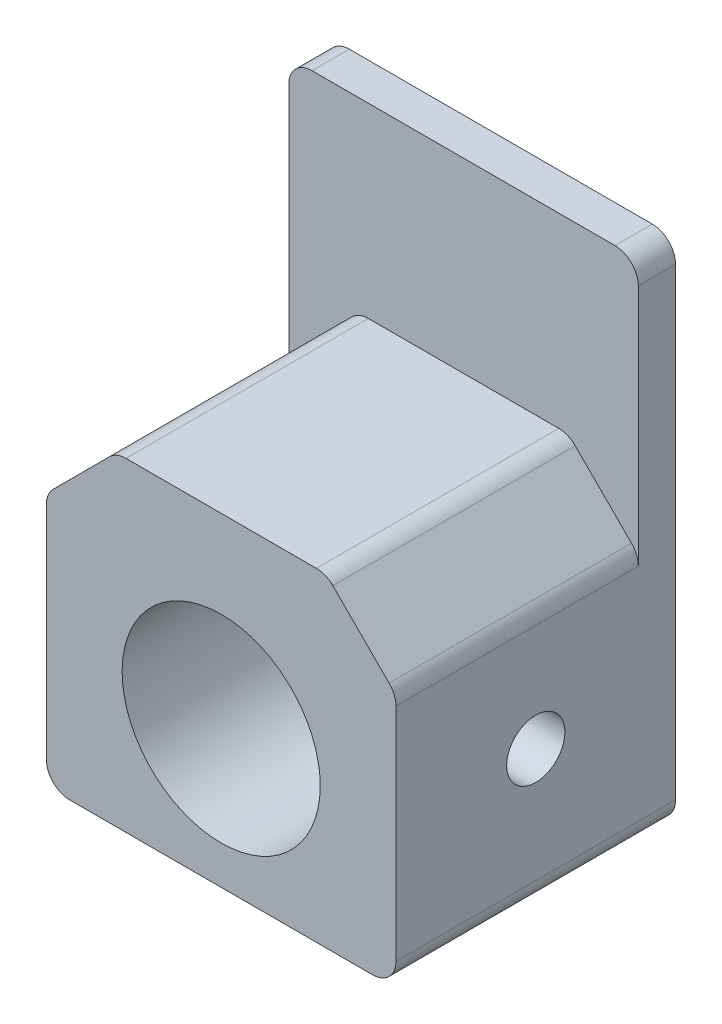
ISO-10303-21;
HEADER;
FILE_DESCRIPTION(('STEP AP214'),'2;1');
FILE_NAME('part.step','',(''),(''),'','','');
FILE_SCHEMA(('AUTOMOTIVE_DESIGN { 1 0 10303 214 1 1 1 1 }'));
ENDSEC;
DATA;
#1=APPLICATION_CONTEXT('core data for automotive mechanical design processes');
#2=APPLICATION_PROTOCOL_DEFINITION('international standard','automotive_design',2000,#1);
#3=PRODUCT_CONTEXT('',#1,'mechanical');
#4=PRODUCT('Part','Part','',(#3));
#5=PRODUCT_RELATED_PRODUCT_CATEGORY('part','',(#4));
#6=PRODUCT_DEFINITION_FORMATION('','',#4);
#7=PRODUCT_DEFINITION_CONTEXT('part definition',#1,'design');
#8=PRODUCT_DEFINITION('design','',#6,#7);
#9=PRODUCT_DEFINITION_SHAPE('','',#8);
#10=(LENGTH_UNIT() NAMED_UNIT(*) SI_UNIT(.MILLI.,.METRE.));
#11=(NAMED_UNIT(*) PLANE_ANGLE_UNIT() SI_UNIT($,.RADIAN.));
#12=(NAMED_UNIT(*) SI_UNIT($,.STERADIAN.) SOLID_ANGLE_UNIT());
#13=UNCERTAINTY_MEASURE_WITH_UNIT(LENGTH_MEASURE(1.E-05),#10,'distance_accuracy_value','');
#14=(GEOMETRIC_REPRESENTATION_CONTEXT(3) GLOBAL_UNCERTAINTY_ASSIGNED_CONTEXT((#13)) GLOBAL_UNIT_ASSIGNED_CONTEXT((#10,
#11,#12)) REPRESENTATION_CONTEXT('',''));
#15=CARTESIAN_POINT('',(0.,0.,0.));
#16=DIRECTION('',(0.,0.,1.));
#17=DIRECTION('',(1.,0.,0.));
#18=AXIS2_PLACEMENT_3D('',#15,#16,#17);
#19=CARTESIAN_POINT('',(-6.5,-9.95,1.6));
#20=DIRECTION('',(0.,0.,1.));
#21=DIRECTION('',(1.,0.,0.));
#22=AXIS2_PLACEMENT_3D('',#19,#20,#21);
#23=PLANE('',#22);
#24=DIRECTION('',(-0.707106781186551,-0.707106781186544,0.));
#25=VECTOR('',#24,1.);
#26=CARTESIAN_POINT('',(-4.5,2.95,1.6));
#27=LINE('',#26,#25);
#28=CARTESIAN_POINT('',(-4.79289321881345,2.65710678118655,1.6));
#29=VERTEX_POINT('',#28);
#30=CARTESIAN_POINT('',(-7.20710678118654,0.242893218813484,1.6));
#31=VERTEX_POINT('',#30);
#32=EDGE_CURVE('E183',#29,#31,#27,.T.);
#33=ORIENTED_EDGE('',*,*,#32,.F.);
#34=CARTESIAN_POINT('',(-4.08578643762691,1.95,1.6));
#35=DIRECTION('',(0.,0.,1.));
#36=DIRECTION('',(1.,0.,0.));
#37=AXIS2_PLACEMENT_3D('',#34,#35,#36);
#38=CIRCLE('',#37,1.);
#39=CARTESIAN_POINT('',(-4.08578643762691,2.95,1.6));
#40=VERTEX_POINT('',#39);
#41=EDGE_CURVE('E11',#29,#40,#38,.F.);
#42=ORIENTED_EDGE('',*,*,#41,.T.);
#43=DIRECTION('',(-1.,0.,0.));
#44=VECTOR('',#43,1.);
#45=CARTESIAN_POINT('',(-4.5,2.95,1.6));
#46=LINE('',#45,#44);
#47=CARTESIAN_POINT('',(4.0857864376269,2.95,1.6));
#48=VERTEX_POINT('',#47);
#49=EDGE_CURVE('E186',#48,#40,#46,.T.);
#50=ORIENTED_EDGE('',*,*,#49,.F.);
#51=CARTESIAN_POINT('',(4.0857864376269,1.95,1.6));
#52=DIRECTION('',(0.,0.,1.));
#53=DIRECTION('',(1.,0.,0.));
#54=AXIS2_PLACEMENT_3D('',#51,#52,#53);
#55=CIRCLE('',#54,1.);
#56=CARTESIAN_POINT('',(4.79289321881345,2.65710678118655,1.6));
#57=VERTEX_POINT('',#56);
#58=EDGE_CURVE('E50',#48,#57,#55,.F.);
#59=ORIENTED_EDGE('',*,*,#58,.T.);
#60=DIRECTION('',(-0.707106781186546,0.707106781186549,0.));
#61=VECTOR('',#60,1.);
#62=CARTESIAN_POINT('',(4.5,2.95,1.6));
#63=LINE('',#62,#61);
#64=CARTESIAN_POINT('',(7.20710678118655,0.242893218813439,1.6));
#65=VERTEX_POINT('',#64);
#66=EDGE_CURVE('E207',#65,#57,#63,.T.);
#67=ORIENTED_EDGE('',*,*,#66,.F.);
#68=CARTESIAN_POINT('',(6.5,-0.464213562373107,1.6));
#69=DIRECTION('',(0.,0.,1.));
#70=DIRECTION('',(1.,0.,0.));
#71=AXIS2_PLACEMENT_3D('',#68,#69,#70);
#72=CIRCLE('',#71,1.);
#73=CARTESIAN_POINT('',(7.5,-0.464213562373107,1.6));
#74=VERTEX_POINT('',#73);
#75=EDGE_CURVE('E298',#65,#74,#72,.F.);
#76=ORIENTED_EDGE('',*,*,#75,.T.);
#77=DIRECTION('',(0.,1.,0.));
#78=VECTOR('',#77,1.);
#79=CARTESIAN_POINT('',(7.5,9.94999999999999,1.6));
#80=LINE('',#79,#78);
#81=CARTESIAN_POINT('',(7.5,9.94999999999999,1.6));
#82=VERTEX_POINT('',#81);
#83=EDGE_CURVE('E238',#74,#82,#80,.T.);
#84=ORIENTED_EDGE('',*,*,#83,.T.);
#85=CARTESIAN_POINT('',(6.5,9.95,1.6));
#86=DIRECTION('',(0.,0.,1.));
#87=DIRECTION('',(1.,0.,0.));
#88=AXIS2_PLACEMENT_3D('',#85,#86,#87);
#89=CIRCLE('',#88,1.);
#90=CARTESIAN_POINT('',(6.49999999999999,10.95,1.6));
#91=VERTEX_POINT('',#90);
#92=EDGE_CURVE('E291',#82,#91,#89,.T.);
#93=ORIENTED_EDGE('',*,*,#92,.T.);
#94=DIRECTION('',(-1.,0.,0.));
#95=VECTOR('',#94,1.);
#96=CARTESIAN_POINT('',(6.49999999999999,10.95,1.6));
#97=LINE('',#96,#95);
#98=CARTESIAN_POINT('',(-6.49999999999999,10.95,1.6));
#99=VERTEX_POINT('',#98);
#100=EDGE_CURVE('E293',#91,#99,#97,.T.);
#101=ORIENTED_EDGE('',*,*,#100,.T.);
#102=CARTESIAN_POINT('',(-6.5,9.95,1.6));
#103=DIRECTION('',(0.,0.,1.));
#104=DIRECTION('',(1.,0.,0.));
#105=AXIS2_PLACEMENT_3D('',#102,#103,#104);
#106=CIRCLE('',#105,1.);
#107=CARTESIAN_POINT('',(-7.5,9.94999999999999,1.6));
#108=VERTEX_POINT('',#107);
#109=EDGE_CURVE('E237',#99,#108,#106,.T.);
#110=ORIENTED_EDGE('',*,*,#109,.T.);
#111=DIRECTION('',(0.,-1.,0.));
#112=VECTOR('',#111,1.);
#113=CARTESIAN_POINT('',(-7.5,9.94999999999999,1.6));
#114=LINE('',#113,#112);
#115=CARTESIAN_POINT('',(-7.5,-0.464213562373063,1.6));
#116=VERTEX_POINT('',#115);
#117=EDGE_CURVE('E233',#108,#116,#114,.T.);
#118=ORIENTED_EDGE('',*,*,#117,.T.);
#119=CARTESIAN_POINT('',(-6.5,-0.464213562373066,1.6));
#120=DIRECTION('',(0.,0.,1.));
#121=DIRECTION('',(1.,0.,0.));
#122=AXIS2_PLACEMENT_3D('',#119,#120,#121);
#123=CIRCLE('',#122,1.);
#124=EDGE_CURVE('E315',#116,#31,#123,.F.);
#125=ORIENTED_EDGE('',*,*,#124,.T.);
#126=EDGE_LOOP('',(#33,#42,#50,#59,#67,#76,#84,#93,#101,#110,#118,#125));
#127=FACE_BOUND('',#126,.T.);
#128=ADVANCED_FACE('F37',(#127),#23,.T.);
#129=CARTESIAN_POINT('',(-6.5,-9.95,0.));
#130=DIRECTION('',(0.,0.,1.));
#131=DIRECTION('',(1.,0.,0.));
#132=AXIS2_PLACEMENT_3D('',#129,#130,#131);
#133=PLANE('',#132);
#134=CARTESIAN_POINT('',(-6.5,-9.95,0.));
#135=DIRECTION('',(0.,0.,1.));
#136=DIRECTION('',(1.,0.,0.));
#137=AXIS2_PLACEMENT_3D('',#134,#135,#136);
#138=CIRCLE('',#137,1.);
#139=CARTESIAN_POINT('',(-7.5,-9.94999999999999,0.));
#140=VERTEX_POINT('',#139);
#141=CARTESIAN_POINT('',(-6.49999999999999,-10.95,0.));
#142=VERTEX_POINT('',#141);
#143=EDGE_CURVE('E163',#140,#142,#138,.T.);
#144=ORIENTED_EDGE('',*,*,#143,.F.);
#145=DIRECTION('',(0.,-1.,0.));
#146=VECTOR('',#145,1.);
#147=CARTESIAN_POINT('',(-7.5,9.94999999999999,0.));
#148=LINE('',#147,#146);
#149=CARTESIAN_POINT('',(-7.5,9.94999999999999,0.));
#150=VERTEX_POINT('',#149);
#151=EDGE_CURVE('E256',#150,#140,#148,.T.);
#152=ORIENTED_EDGE('',*,*,#151,.F.);
#153=CARTESIAN_POINT('',(-6.5,9.95,0.));
#154=DIRECTION('',(0.,0.,1.));
#155=DIRECTION('',(1.,0.,0.));
#156=AXIS2_PLACEMENT_3D('',#153,#154,#155);
#157=CIRCLE('',#156,1.);
#158=CARTESIAN_POINT('',(-6.49999999999999,10.95,0.));
#159=VERTEX_POINT('',#158);
#160=EDGE_CURVE('E254',#159,#150,#157,.T.);
#161=ORIENTED_EDGE('',*,*,#160,.F.);
#162=DIRECTION('',(-1.,0.,0.));
#163=VECTOR('',#162,1.);
#164=CARTESIAN_POINT('',(6.49999999999999,10.95,0.));
#165=LINE('',#164,#163);
#166=CARTESIAN_POINT('',(6.49999999999999,10.95,0.));
#167=VERTEX_POINT('',#166);
#168=EDGE_CURVE('E252',#167,#159,#165,.T.);
#169=ORIENTED_EDGE('',*,*,#168,.F.);
#170=CARTESIAN_POINT('',(6.5,9.95,0.));
#171=DIRECTION('',(0.,0.,1.));
#172=DIRECTION('',(1.,0.,0.));
#173=AXIS2_PLACEMENT_3D('',#170,#171,#172);
#174=CIRCLE('',#173,1.);
#175=CARTESIAN_POINT('',(7.5,9.94999999999999,0.));
#176=VERTEX_POINT('',#175);
#177=EDGE_CURVE('E250',#176,#167,#174,.T.);
#178=ORIENTED_EDGE('',*,*,#177,.F.);
#179=DIRECTION('',(0.,1.,0.));
#180=VECTOR('',#179,1.);
#181=CARTESIAN_POINT('',(7.5,9.94999999999999,0.));
#182=LINE('',#181,#180);
#183=CARTESIAN_POINT('',(7.5,-9.94999999999999,0.));
#184=VERTEX_POINT('',#183);
#185=EDGE_CURVE('E248',#184,#176,#182,.T.);
#186=ORIENTED_EDGE('',*,*,#185,.F.);
#187=CARTESIAN_POINT('',(6.5,-9.95,0.));
#188=DIRECTION('',(0.,0.,1.));
#189=DIRECTION('',(1.,0.,0.));
#190=AXIS2_PLACEMENT_3D('',#187,#188,#189);
#191=CIRCLE('',#190,1.);
#192=CARTESIAN_POINT('',(6.5,-10.95,0.));
#193=VERTEX_POINT('',#192);
#194=EDGE_CURVE('E246',#193,#184,#191,.T.);
#195=ORIENTED_EDGE('',*,*,#194,.F.);
#196=DIRECTION('',(1.,0.,0.));
#197=VECTOR('',#196,1.);
#198=CARTESIAN_POINT('',(6.5,-10.95,0.));
#199=LINE('',#198,#197);
#200=EDGE_CURVE('E244',#142,#193,#199,.T.);
#201=ORIENTED_EDGE('',*,*,#200,.F.);
#202=EDGE_LOOP('',(#144,#152,#161,#169,#178,#186,#195,#201));
#203=FACE_BOUND('',#202,.T.);
#204=CARTESIAN_POINT('',(0.,-5.05,0.));
#205=DIRECTION('',(0.,0.,1.));
#206=DIRECTION('',(1.,0.,0.));
#207=AXIS2_PLACEMENT_3D('',#204,#205,#206);
#208=CIRCLE('',#207,4.25);
#209=CARTESIAN_POINT('',(4.25,-5.05,0.));
#210=VERTEX_POINT('',#209);
#211=EDGE_CURVE('E205',#210,#210,#208,.T.);
#212=ORIENTED_EDGE('',*,*,#211,.T.);
#213=EDGE_LOOP('',(#212));
#214=FACE_BOUND('',#213,.T.);
#215=ADVANCED_FACE('F279',(#203,#214),#133,.F.);
#216=CARTESIAN_POINT('',(-6.5,-9.95,1.6));
#217=DIRECTION('',(0.,0.,-1.));
#218=DIRECTION('',(-1.,0.,0.));
#219=AXIS2_PLACEMENT_3D('',#216,#217,#218);
#220=CYLINDRICAL_SURFACE('',#219,1.);
#221=ORIENTED_EDGE('',*,*,#143,.T.);
#222=DIRECTION('',(0.,0.,-1.));
#223=VECTOR('',#222,1.);
#224=CARTESIAN_POINT('',(-6.49999999999999,-10.95,1.6));
#225=LINE('',#224,#223);
#226=CARTESIAN_POINT('',(-6.49999999999999,-10.95,12.));
#227=VERTEX_POINT('',#226);
#228=EDGE_CURVE('E156',#227,#142,#225,.T.);
#229=ORIENTED_EDGE('',*,*,#228,.F.);
#230=CARTESIAN_POINT('',(-6.5,-9.95,12.));
#231=DIRECTION('',(0.,0.,1.));
#232=DIRECTION('',(1.,0.,0.));
#233=AXIS2_PLACEMENT_3D('',#230,#231,#232);
#234=CIRCLE('',#233,1.);
#235=CARTESIAN_POINT('',(-7.5,-9.94999999999999,12.));
#236=VERTEX_POINT('',#235);
#237=EDGE_CURVE('E161',#236,#227,#234,.T.);
#238=ORIENTED_EDGE('',*,*,#237,.F.);
#239=DIRECTION('',(0.,0.,-1.));
#240=VECTOR('',#239,1.);
#241=CARTESIAN_POINT('',(-7.5,-9.94999999999999,1.6));
#242=LINE('',#241,#240);
#243=EDGE_CURVE('E236',#236,#140,#242,.T.);
#244=ORIENTED_EDGE('',*,*,#243,.T.);
#245=EDGE_LOOP('',(#221,#229,#238,#244));
#246=FACE_BOUND('',#245,.T.);
#247=ADVANCED_FACE('F158',(#246),#220,.T.);
#248=CARTESIAN_POINT('',(6.5,-10.95,1.6));
#249=DIRECTION('',(0.,1.,0.));
#250=DIRECTION('',(0.,0.,1.));
#251=AXIS2_PLACEMENT_3D('',#248,#249,#250);
#252=PLANE('',#251);
#253=ORIENTED_EDGE('',*,*,#200,.T.);
#254=DIRECTION('',(0.,0.,-1.));
#255=VECTOR('',#254,1.);
#256=CARTESIAN_POINT('',(6.5,-10.95,1.6));
#257=LINE('',#256,#255);
#258=CARTESIAN_POINT('',(6.5,-10.95,12.));
#259=VERTEX_POINT('',#258);
#260=EDGE_CURVE('E166',#259,#193,#257,.T.);
#261=ORIENTED_EDGE('',*,*,#260,.F.);
#262=DIRECTION('',(1.,0.,0.));
#263=VECTOR('',#262,1.);
#264=CARTESIAN_POINT('',(-6.49999999999999,-10.95,12.));
#265=LINE('',#264,#263);
#266=EDGE_CURVE('E169',#227,#259,#265,.T.);
#267=ORIENTED_EDGE('',*,*,#266,.F.);
#268=ORIENTED_EDGE('',*,*,#228,.T.);
#269=EDGE_LOOP('',(#253,#261,#267,#268));
#270=FACE_BOUND('',#269,.T.);
#271=ADVANCED_FACE('F170',(#270),#252,.F.);
#272=CARTESIAN_POINT('',(6.5,-9.95,1.6));
#273=DIRECTION('',(0.,0.,-1.));
#274=DIRECTION('',(-1.,0.,0.));
#275=AXIS2_PLACEMENT_3D('',#272,#273,#274);
#276=CYLINDRICAL_SURFACE('',#275,1.);
#277=ORIENTED_EDGE('',*,*,#194,.T.);
#278=DIRECTION('',(0.,0.,-1.));
#279=VECTOR('',#278,1.);
#280=CARTESIAN_POINT('',(7.5,-9.94999999999999,1.6));
#281=LINE('',#280,#279);
#282=CARTESIAN_POINT('',(7.5,-9.94999999999999,12.));
#283=VERTEX_POINT('',#282);
#284=EDGE_CURVE('E271',#283,#184,#281,.T.);
#285=ORIENTED_EDGE('',*,*,#284,.F.);
#286=CARTESIAN_POINT('',(6.5,-9.95,12.));
#287=DIRECTION('',(0.,0.,1.));
#288=DIRECTION('',(1.,0.,0.));
#289=AXIS2_PLACEMENT_3D('',#286,#287,#288);
#290=CIRCLE('',#289,1.);
#291=EDGE_CURVE('E175',#259,#283,#290,.T.);
#292=ORIENTED_EDGE('',*,*,#291,.F.);
#293=ORIENTED_EDGE('',*,*,#260,.T.);
#294=EDGE_LOOP('',(#277,#285,#292,#293));
#295=FACE_BOUND('',#294,.T.);
#296=ADVANCED_FACE('F276',(#295),#276,.T.);
#297=CARTESIAN_POINT('',(7.5,9.94999999999999,1.6));
#298=DIRECTION('',(-1.,0.,0.));
#299=DIRECTION('',(0.,-1.,0.));
#300=AXIS2_PLACEMENT_3D('',#297,#298,#299);
#301=PLANE('',#300);
#302=CARTESIAN_POINT('',(7.5,-5.05,6.));
#303=DIRECTION('',(1.,0.,0.));
#304=DIRECTION('',(0.,1.,0.));
#305=AXIS2_PLACEMENT_3D('',#302,#303,#304);
#306=CIRCLE('',#305,1.25);
#307=CARTESIAN_POINT('',(7.5,-3.8,6.));
#308=VERTEX_POINT('',#307);
#309=EDGE_CURVE('E556',#308,#308,#306,.T.);
#310=ORIENTED_EDGE('',*,*,#309,.F.);
#311=EDGE_LOOP('',(#310));
#312=FACE_BOUND('',#311,.T.);
#313=ORIENTED_EDGE('',*,*,#83,.F.);
#314=DIRECTION('',(0.,0.,-1.));
#315=VECTOR('',#314,1.);
#316=CARTESIAN_POINT('',(7.5,-0.464213562373106,1.6));
#317=LINE('',#316,#315);
#318=CARTESIAN_POINT('',(7.5,-0.464213562373106,12.));
#319=VERTEX_POINT('',#318);
#320=EDGE_CURVE('E300',#74,#319,#317,.F.);
#321=ORIENTED_EDGE('',*,*,#320,.T.);
#322=DIRECTION('',(0.,1.,0.));
#323=VECTOR('',#322,1.);
#324=CARTESIAN_POINT('',(7.5,-9.94999999999999,12.));
#325=LINE('',#324,#323);
#326=EDGE_CURVE('E193',#283,#319,#325,.T.);
#327=ORIENTED_EDGE('',*,*,#326,.F.);
#328=ORIENTED_EDGE('',*,*,#284,.T.);
#329=ORIENTED_EDGE('',*,*,#185,.T.);
#330=DIRECTION('',(0.,0.,-1.));
#331=VECTOR('',#330,1.);
#332=CARTESIAN_POINT('',(7.5,9.94999999999999,1.6));
#333=LINE('',#332,#331);
#334=EDGE_CURVE('E268',#82,#176,#333,.T.);
#335=ORIENTED_EDGE('',*,*,#334,.F.);
#336=EDGE_LOOP('',(#313,#321,#327,#328,#329,#335));
#337=FACE_BOUND('',#336,.T.);
#338=ADVANCED_FACE('F285',(#312,#337),#301,.F.);
#339=CARTESIAN_POINT('',(6.5,9.95,1.6));
#340=DIRECTION('',(0.,0.,-1.));
#341=DIRECTION('',(-1.,0.,0.));
#342=AXIS2_PLACEMENT_3D('',#339,#340,#341);
#343=CYLINDRICAL_SURFACE('',#342,1.);
#344=ORIENTED_EDGE('',*,*,#177,.T.);
#345=DIRECTION('',(0.,0.,-1.));
#346=VECTOR('',#345,1.);
#347=CARTESIAN_POINT('',(6.49999999999999,10.95,1.6));
#348=LINE('',#347,#346);
#349=EDGE_CURVE('E265',#91,#167,#348,.T.);
#350=ORIENTED_EDGE('',*,*,#349,.F.);
#351=ORIENTED_EDGE('',*,*,#92,.F.);
#352=ORIENTED_EDGE('',*,*,#334,.T.);
#353=EDGE_LOOP('',(#344,#350,#351,#352));
#354=FACE_BOUND('',#353,.T.);
#355=ADVANCED_FACE('F289',(#354),#343,.T.);
#356=CARTESIAN_POINT('',(6.49999999999999,10.95,1.6));
#357=DIRECTION('',(0.,-1.,0.));
#358=DIRECTION('',(1.,0.,0.));
#359=AXIS2_PLACEMENT_3D('',#356,#357,#358);
#360=PLANE('',#359);
#361=ORIENTED_EDGE('',*,*,#168,.T.);
#362=DIRECTION('',(0.,0.,-1.));
#363=VECTOR('',#362,1.);
#364=CARTESIAN_POINT('',(-6.49999999999999,10.95,1.6));
#365=LINE('',#364,#363);
#366=EDGE_CURVE('E262',#99,#159,#365,.T.);
#367=ORIENTED_EDGE('',*,*,#366,.F.);
#368=ORIENTED_EDGE('',*,*,#100,.F.);
#369=ORIENTED_EDGE('',*,*,#349,.T.);
#370=EDGE_LOOP('',(#361,#367,#368,#369));
#371=FACE_BOUND('',#370,.T.);
#372=ADVANCED_FACE('F361',(#371),#360,.F.);
#373=CARTESIAN_POINT('',(-6.5,9.95,1.6));
#374=DIRECTION('',(0.,0.,-1.));
#375=DIRECTION('',(-1.,0.,0.));
#376=AXIS2_PLACEMENT_3D('',#373,#374,#375);
#377=CYLINDRICAL_SURFACE('',#376,1.);
#378=ORIENTED_EDGE('',*,*,#160,.T.);
#379=DIRECTION('',(0.,0.,-1.));
#380=VECTOR('',#379,1.);
#381=CARTESIAN_POINT('',(-7.5,9.94999999999999,1.6));
#382=LINE('',#381,#380);
#383=EDGE_CURVE('E259',#108,#150,#382,.T.);
#384=ORIENTED_EDGE('',*,*,#383,.F.);
#385=ORIENTED_EDGE('',*,*,#109,.F.);
#386=ORIENTED_EDGE('',*,*,#366,.T.);
#387=EDGE_LOOP('',(#378,#384,#385,#386));
#388=FACE_BOUND('',#387,.T.);
#389=ADVANCED_FACE('F357',(#388),#377,.T.);
#390=CARTESIAN_POINT('',(-7.5,9.94999999999999,1.6));
#391=DIRECTION('',(1.,0.,0.));
#392=DIRECTION('',(0.,1.,0.));
#393=AXIS2_PLACEMENT_3D('',#390,#391,#392);
#394=PLANE('',#393);
#395=CARTESIAN_POINT('',(-7.5,-5.05,6.));
#396=DIRECTION('',(1.,0.,0.));
#397=DIRECTION('',(0.,1.,0.));
#398=AXIS2_PLACEMENT_3D('',#395,#396,#397);
#399=CIRCLE('',#398,1.25);
#400=CARTESIAN_POINT('',(-7.5,-3.8,6.));
#401=VERTEX_POINT('',#400);
#402=EDGE_CURVE('E322',#401,#401,#399,.T.);
#403=ORIENTED_EDGE('',*,*,#402,.T.);
#404=EDGE_LOOP('',(#403));
#405=FACE_BOUND('',#404,.T.);
#406=DIRECTION('',(0.,-1.,0.));
#407=VECTOR('',#406,1.);
#408=CARTESIAN_POINT('',(-7.5,-0.0499999999999685,12.));
#409=LINE('',#408,#407);
#410=CARTESIAN_POINT('',(-7.5,-0.464213562373066,12.));
#411=VERTEX_POINT('',#410);
#412=EDGE_CURVE('E181',#411,#236,#409,.T.);
#413=ORIENTED_EDGE('',*,*,#412,.F.);
#414=DIRECTION('',(0.,0.,-1.));
#415=VECTOR('',#414,1.);
#416=CARTESIAN_POINT('',(-7.5,-0.464213562373066,1.6));
#417=LINE('',#416,#415);
#418=EDGE_CURVE('E165',#411,#116,#417,.T.);
#419=ORIENTED_EDGE('',*,*,#418,.T.);
#420=ORIENTED_EDGE('',*,*,#117,.F.);
#421=ORIENTED_EDGE('',*,*,#383,.T.);
#422=ORIENTED_EDGE('',*,*,#151,.T.);
#423=ORIENTED_EDGE('',*,*,#243,.F.);
#424=EDGE_LOOP('',(#413,#419,#420,#421,#422,#423));
#425=FACE_BOUND('',#424,.T.);
#426=ADVANCED_FACE('F354',(#405,#425),#394,.F.);
#427=CARTESIAN_POINT('',(0.,-5.05,1.6));
#428=DIRECTION('',(0.,0.,-1.));
#429=DIRECTION('',(-1.,0.,0.));
#430=AXIS2_PLACEMENT_3D('',#427,#428,#429);
#431=CYLINDRICAL_SURFACE('',#430,4.25);
#432=CARTESIAN_POINT('',(-4.25,-5.05,7.25));
#433=CARTESIAN_POINT('',(-4.24999930992281,-5.11863554386375,7.24999900472863));
#434=CARTESIAN_POINT('',(-4.2483213689547,-5.18728119426218,7.24432820804852));
#435=CARTESIAN_POINT('',(-4.24179146546145,-5.32257739512948,7.22184614481979));
#436=CARTESIAN_POINT('',(-4.23693845057856,-5.38922727645144,7.20503118458611));
#437=CARTESIAN_POINT('',(-4.22459087845846,-5.51856069871208,7.16086792453522));
#438=CARTESIAN_POINT('',(-4.2171001308669,-5.5812498069511,7.13353481070463));
#439=CARTESIAN_POINT('',(-4.20025804797531,-5.70115506897812,7.06917232142158));
#440=CARTESIAN_POINT('',(-4.19090648689949,-5.75837055739354,7.03214176918934));
#441=CARTESIAN_POINT('',(-4.17105280318619,-5.86728958058164,6.94835412878236));
#442=CARTESIAN_POINT('',(-4.16052779861817,-5.91882001459687,6.90137745212791));
#443=CARTESIAN_POINT('',(-4.13965182411038,-6.0133967390649,6.7994993123515));
#444=CARTESIAN_POINT('',(-4.12930088233949,-6.05644166815341,6.74459658006366));
#445=CARTESIAN_POINT('',(-4.10970444711726,-6.13372390210837,6.62697552875973));
#446=CARTESIAN_POINT('',(-4.10048747181193,-6.16775217731388,6.56411467207143));
#447=CARTESIAN_POINT('',(-4.08454353281206,-6.22468483570553,6.43324812185613));
#448=CARTESIAN_POINT('',(-4.07781599741555,-6.24759177329367,6.36524361389894));
#449=CARTESIAN_POINT('',(-4.06785070234241,-6.28101154523395,6.22795928924987));
#450=CARTESIAN_POINT('',(-4.06452355441097,-6.29184256631974,6.15876358990745));
#451=CARTESIAN_POINT('',(-4.06146960690046,-6.30179636929176,6.01946339991023));
#452=CARTESIAN_POINT('',(-4.06174197291898,-6.30092186463229,5.94935912363657));
#453=CARTESIAN_POINT('',(-4.06577691087315,-6.28773985211888,5.81279952917077));
#454=CARTESIAN_POINT('',(-4.06941857516521,-6.27582838501146,5.74630182173207));
#455=CARTESIAN_POINT('',(-4.07958655321941,-6.24154941487809,5.61629361847425));
#456=CARTESIAN_POINT('',(-4.08611314168587,-6.21918091611518,5.55278340776383));
#457=CARTESIAN_POINT('',(-4.10141385625078,-6.16432552801202,5.42957267716731));
#458=CARTESIAN_POINT('',(-4.11021665889658,-6.1317083019302,5.36993389824831));
#459=CARTESIAN_POINT('',(-4.12906386636806,-6.05737198019808,5.25684231231687));
#460=CARTESIAN_POINT('',(-4.13910856173143,-6.01565075293668,5.2033909585217));
#461=CARTESIAN_POINT('',(-4.1598005263452,-5.92231308770724,5.10194206636871));
#462=CARTESIAN_POINT('',(-4.17045581602961,-5.87036723722077,5.05424873441264));
#463=CARTESIAN_POINT('',(-4.1908110845525,-5.75908227718264,4.96818099303026));
#464=CARTESIAN_POINT('',(-4.20051100780644,-5.69974273791045,4.92980712563301));
#465=CARTESIAN_POINT('',(-4.21794545532469,-5.57481712189143,4.86329249004801));
#466=CARTESIAN_POINT('',(-4.22566737056875,-5.50919446376501,4.83521690238454));
#467=CARTESIAN_POINT('',(-4.23818490267892,-5.37387941634345,4.79058948714007));
#468=CARTESIAN_POINT('',(-4.24298130281601,-5.3041881218562,4.77403457487137));
#469=CARTESIAN_POINT('',(-4.24898448512815,-5.16530203443505,4.75341955540197));
#470=CARTESIAN_POINT('',(-4.25030973012029,-5.0961734996143,4.74894693256211));
#471=CARTESIAN_POINT('',(-4.24956754426295,-4.95815023876116,4.75147036637586));
#472=CARTESIAN_POINT('',(-4.24750054707309,-4.88925548397088,4.75846495707643));
#473=CARTESIAN_POINT('',(-4.24028351138608,-4.75519682163286,4.78338972212502));
#474=CARTESIAN_POINT('',(-4.23520090490568,-4.68998450141504,4.80108087100581));
#475=CARTESIAN_POINT('',(-4.2225384085764,-4.56346620488592,4.84661083845978));
#476=CARTESIAN_POINT('',(-4.21495822299634,-4.50216069219485,4.87445085877322));
#477=CARTESIAN_POINT('',(-4.19787583813263,-4.38366263764474,4.94019394932849));
#478=CARTESIAN_POINT('',(-4.18833418383976,-4.32659387866223,4.97830960706968));
#479=CARTESIAN_POINT('',(-4.16842603414368,-4.21952109921249,5.06326211008205));
#480=CARTESIAN_POINT('',(-4.15805934024782,-4.16951878691109,5.11010105770562));
#481=CARTESIAN_POINT('',(-4.13721813950511,-4.07619577999222,5.21310703581675));
#482=CARTESIAN_POINT('',(-4.12675243996587,-4.03316823857288,5.26954200638309));
#483=CARTESIAN_POINT('',(-4.10728383907013,-3.9571762074339,5.38905818611512));
#484=CARTESIAN_POINT('',(-4.09828089362595,-3.92421141439482,5.45213919487349));
#485=CARTESIAN_POINT('',(-4.0828616860317,-3.86951322067103,5.58292863919521));
#486=CARTESIAN_POINT('',(-4.07643264682471,-3.84772418709659,5.65061221581748));
#487=CARTESIAN_POINT('',(-4.06691646272594,-3.81591268211699,5.78891057918174));
#488=CARTESIAN_POINT('',(-4.06382822870653,-3.80588637588415,5.85952440284114));
#489=CARTESIAN_POINT('',(-4.06144770378985,-3.79813863089814,5.99864187967785));
#490=CARTESIAN_POINT('',(-4.06200839075119,-3.79994063246623,6.06711683222545));
#491=CARTESIAN_POINT('',(-4.06651074533781,-3.81466670686848,6.20274113476889));
#492=CARTESIAN_POINT('',(-4.07045228722674,-3.82759036608048,6.26989053396797));
#493=CARTESIAN_POINT('',(-4.08117557028351,-3.8638907050438,6.40021179477164));
#494=CARTESIAN_POINT('',(-4.08792423264819,-3.8871458501534,6.46342043049427));
#495=CARTESIAN_POINT('',(-4.10349642753123,-3.94335474026196,6.58508919304634));
#496=CARTESIAN_POINT('',(-4.11232034496706,-3.97631028477268,6.64354843625073));
#497=CARTESIAN_POINT('',(-4.13143620335433,-4.05234244706471,6.75628227053613));
#498=CARTESIAN_POINT('',(-4.14176885896291,-4.09573424854025,6.81033738894418));
#499=CARTESIAN_POINT('',(-4.16253516372216,-4.19083400561862,6.91055345706747));
#500=CARTESIAN_POINT('',(-4.17296883808391,-4.24254409024979,6.95671237952809));
#501=CARTESIAN_POINT('',(-4.19310819601157,-4.35453967198608,7.04109802055843));
#502=CARTESIAN_POINT('',(-4.20278568328436,-4.41502314195002,7.07906939666282));
#503=CARTESIAN_POINT('',(-4.21998983334609,-4.54180031440317,7.14424960767533));
#504=CARTESIAN_POINT('',(-4.22751757304272,-4.60809108592105,7.17146383396983));
#505=CARTESIAN_POINT('',(-4.23885744276476,-4.73655619170069,7.21170887707934));
#506=CARTESIAN_POINT('',(-4.24300215060248,-4.79829943046236,7.22603021216252));
#507=CARTESIAN_POINT('',(-4.24857354019935,-4.92335907282786,7.24517550818528));
#508=CARTESIAN_POINT('',(-4.25000063668143,-4.98667523490042,7.25000091826075));
#509=CARTESIAN_POINT('',(-4.25,-5.05,7.25));
#510=B_SPLINE_CURVE_WITH_KNOTS('',3,(#432,#433,#434,#435,#436,#437,#438,#439,#440,#441,#442,
#443,#444,#445,#446,#447,#448,#449,#450,#451,#452,#453,#454,#455,#456,#457,#458,#459,#460,#461,
#462,#463,#464,#465,#466,#467,#468,#469,#470,#471,#472,#473,#474,#475,#476,#477,#478,#479,#480,
#481,#482,#483,#484,#485,#486,#487,#488,#489,#490,#491,#492,#493,#494,#495,#496,#497,#498,#499,
#500,#501,#502,#503,#504,#505,#506,#507,#508,#509),.UNSPECIFIED.,.T.,.F.,(4,2,2,2,2,2,2,2,2,2,2,
2,2,2,2,2,2,2,2,2,2,2,2,2,2,2,2,2,2,2,2,2,2,2,2,2,2,2,4),(0.,0.205674096047323,
0.411416396003569,0.616862755440256,0.822334057262243,1.03293090365469,1.24356150951289,
1.4587160926743,1.67382123469588,1.88311381216327,2.09235787442331,2.29437279850957,
2.49640696273218,2.70112221857498,2.90588545798342,3.1188504113525,3.33182774800424,
3.54613071885467,3.76037628748497,3.96720869019715,4.17401465379702,4.37636182629111,
4.57873296674811,4.78566349692433,4.99264396298403,5.20682894003376,5.42100746031015,
5.63410919267723,5.84714143132131,6.05164484122161,6.25614064582704,6.45829205831932,
6.66048099538516,6.86978063785166,7.07913393513268,7.29429037274018,7.50933883873773,
7.6991275564398,7.88888730898317),.UNSPECIFIED.);
#511=CARTESIAN_POINT('',(-4.25,-5.05,7.25));
#512=VERTEX_POINT('',#511);
#513=EDGE_CURVE('E41',#512,#512,#510,.T.);
#514=ORIENTED_EDGE('',*,*,#513,.F.);
#515=EDGE_LOOP('',(#514));
#516=FACE_BOUND('',#515,.T.);
#517=CARTESIAN_POINT('',(4.06201920231798,-3.8,6.));
#518=CARTESIAN_POINT('',(4.06202002384614,-3.80000101881834,5.9314369264176));
#519=CARTESIAN_POINT('',(4.06377411745012,-3.80566026827094,5.86286371138975));
#520=CARTESIAN_POINT('',(4.07057426850513,-3.82809231248807,5.72771759153431));
#521=CARTESIAN_POINT('',(4.07562152462732,-3.84486915395584,5.66114542429702));
#522=CARTESIAN_POINT('',(4.08838798643785,-3.8889210669074,5.53197708188119));
#523=CARTESIAN_POINT('',(4.09610287459703,-3.91617918251866,5.46937467426869));
#524=CARTESIAN_POINT('',(4.11332954813439,-3.98036460138612,5.34961698352184));
#525=CARTESIAN_POINT('',(4.12284157955185,-4.01729322885876,5.29246244784643));
#526=CARTESIAN_POINT('',(4.14291522162272,-4.10097378753416,5.18348445410976));
#527=CARTESIAN_POINT('',(4.15349852610268,-4.14796828588104,5.131851208528));
#528=CARTESIAN_POINT('',(4.17433657893651,-4.24992641107243,5.03707327759341));
#529=CARTESIAN_POINT('',(4.18459128652479,-4.30489102204843,4.99392964207136));
#530=CARTESIAN_POINT('',(4.20386234348634,-4.42257597734983,4.91653572161275));
#531=CARTESIAN_POINT('',(4.2128501454656,-4.48542836280759,4.88247848834119));
#532=CARTESIAN_POINT('',(4.22832324357593,-4.61627718148439,4.82549005880489));
#533=CARTESIAN_POINT('',(4.23480905737476,-4.68427254712172,4.80255656075795));
#534=CARTESIAN_POINT('',(4.24439392585677,-4.82148799708077,4.76909351243641));
#535=CARTESIAN_POINT('',(4.24758140485659,-4.89062266305583,4.75823948607632));
#536=CARTESIAN_POINT('',(4.2505214475694,-5.02980030283419,4.74821843694182));
#537=CARTESIAN_POINT('',(4.25027470565523,-5.09984309016109,4.74904905162391));
#538=CARTESIAN_POINT('',(4.24643703464214,-5.23657567121766,4.76215392929252));
#539=CARTESIAN_POINT('',(4.24294874744343,-5.30330245936683,4.77407696948529));
#540=CARTESIAN_POINT('',(4.23314400444152,-5.43376242138122,4.80845569095125));
#541=CARTESIAN_POINT('',(4.2268273723106,-5.49749540832992,4.83091202890674));
#542=CARTESIAN_POINT('',(4.21193189034758,-5.6210048056453,4.88596337530357));
#543=CARTESIAN_POINT('',(4.20332816159911,-5.68072805661996,4.91867063961982));
#544=CARTESIAN_POINT('',(4.18477379645637,-5.79395210402709,4.99320712809171));
#545=CARTESIAN_POINT('',(4.17482285073138,-5.84745146614924,5.0350384485481));
#546=CARTESIAN_POINT('',(4.15420566116509,-5.94880554141673,5.12846531983852));
#547=CARTESIAN_POINT('',(4.1435265765891,-5.99637709966763,5.18036561678081));
#548=CARTESIAN_POINT('',(4.12298149082422,-6.08221946679905,5.29151278229238));
#549=CARTESIAN_POINT('',(4.11311556410406,-6.12048942446625,5.35076032247804));
#550=CARTESIAN_POINT('',(4.09525415864892,-6.18692233667881,5.47564107645778));
#551=CARTESIAN_POINT('',(4.08727611131959,-6.21499229203919,5.54132643740554));
#552=CARTESIAN_POINT('',(4.07430199351848,-6.25959037704074,5.67678025147386));
#553=CARTESIAN_POINT('',(4.06930499457416,-6.27612210063392,5.74654742583769));
#554=CARTESIAN_POINT('',(4.06306145763288,-6.29665285506278,5.8854979960723));
#555=CARTESIAN_POINT('',(4.06168661793754,-6.30108083894691,5.95461230197694));
#556=CARTESIAN_POINT('',(4.06248895789175,-6.29847337038998,6.09259738918381));
#557=CARTESIAN_POINT('',(4.06466566321262,-6.29143944875063,6.16146820177486));
#558=CARTESIAN_POINT('',(4.07220026548623,-6.26648919132026,6.29524787237086));
#559=CARTESIAN_POINT('',(4.07747834041926,-6.24884566453069,6.36021255936346));
#560=CARTESIAN_POINT('',(4.09053913849499,-6.20349157080574,6.48625630112687));
#561=CARTESIAN_POINT('',(4.09832223796621,-6.17577949119636,6.54733477042098));
#562=CARTESIAN_POINT('',(4.11576758428958,-6.11025091175575,6.66562611315996));
#563=CARTESIAN_POINT('',(4.12547339058582,-6.07219064783071,6.72269736877311));
#564=CARTESIAN_POINT('',(4.14557539478669,-5.98733786403159,6.8297999781229));
#565=CARTESIAN_POINT('',(4.15597175108244,-5.94054333629745,6.87982970848364));
#566=CARTESIAN_POINT('',(4.17673734027942,-5.83753958189029,6.97328757853941));
#567=CARTESIAN_POINT('',(4.18709206666596,-5.78105163289789,7.01641248103129));
#568=CARTESIAN_POINT('',(4.20622873879586,-5.66139607850987,7.09257640994849));
#569=CARTESIAN_POINT('',(4.21501076466647,-5.5982288136786,7.12561595027177));
#570=CARTESIAN_POINT('',(4.22995779741892,-5.467434850399,7.18035326228051));
#571=CARTESIAN_POINT('',(4.23614244146315,-5.39984624966686,7.20213643636309));
#572=CARTESIAN_POINT('',(4.24528461751223,-5.26175418450172,7.23396802651774));
#573=CARTESIAN_POINT('',(4.24824303372867,-5.19125152422516,7.24401965790431));
#574=CARTESIAN_POINT('',(4.25054778996796,-5.05214031632726,7.25186607495326));
#575=CARTESIAN_POINT('',(4.25002398293165,-4.98355845600112,7.25010147249262));
#576=CARTESIAN_POINT('',(4.24572691913203,-4.84771006048625,7.23541324076557));
#577=CARTESIAN_POINT('',(4.24195383445172,-4.78044345583401,7.2224902024541));
#578=CARTESIAN_POINT('',(4.23161721762378,-4.6497849689642,7.18612069671541));
#579=CARTESIAN_POINT('',(4.22508188084574,-4.58636114251368,7.162780430784));
#580=CARTESIAN_POINT('',(4.20989761307318,-4.46429575852014,7.10633372704934));
#581=CARTESIAN_POINT('',(4.20124834272586,-4.40565497082306,7.0732257210398));
#582=CARTESIAN_POINT('',(4.18241367531218,-4.29284068908496,6.99698922635025));
#583=CARTESIAN_POINT('',(4.17218889677264,-4.2388626312379,6.95358133365051));
#584=CARTESIAN_POINT('',(4.15148729633762,-4.13880910872425,6.85848526711556));
#585=CARTESIAN_POINT('',(4.14101040381872,-4.09273588848889,6.80679474961358));
#586=CARTESIAN_POINT('',(4.12064287601544,-4.00849279361498,6.69484335360865));
#587=CARTESIAN_POINT('',(4.11077723881113,-3.97058362728605,6.63438125496552));
#588=CARTESIAN_POINT('',(4.09314015839048,-3.90551454311952,6.50766106366361));
#589=CARTESIAN_POINT('',(4.08536763930268,-3.87834909958557,6.44140597191646));
#590=CARTESIAN_POINT('',(4.07362404243162,-3.8381950651446,6.31305347193246));
#591=CARTESIAN_POINT('',(4.06931221106166,-3.82391024614187,6.25139037889872));
#592=CARTESIAN_POINT('',(4.063509668452,-3.80481310446474,6.12648754148259));
#593=CARTESIAN_POINT('',(4.06201844447443,-3.79999906016014,6.06324808577387));
#594=CARTESIAN_POINT('',(4.06201920231798,-3.8,6.));
#595=B_SPLINE_CURVE_WITH_KNOTS('',3,(#517,#518,#519,#520,#521,#522,#523,#524,#525,#526,#527,
#528,#529,#530,#531,#532,#533,#534,#535,#536,#537,#538,#539,#540,#541,#542,#543,#544,#545,#546,
#547,#548,#549,#550,#551,#552,#553,#554,#555,#556,#557,#558,#559,#560,#561,#562,#563,#564,#565,
#566,#567,#568,#569,#570,#571,#572,#573,#574,#575,#576,#577,#578,#579,#580,#581,#582,#583,#584,
#585,#586,#587,#588,#589,#590,#591,#592,#593,#594),.UNSPECIFIED.,.T.,.F.,(4,2,2,2,2,2,2,2,2,2,2,
2,2,2,2,2,2,2,2,2,2,2,2,2,2,2,2,2,2,2,2,2,2,2,2,2,2,2,4),(0.,0.205456049939047,
0.410986925134936,0.616186696271429,0.821414580824594,1.03229554625482,1.24320257299881,
1.45828653945174,1.67332598058438,1.88243811419583,2.09150796756895,2.29417538337437,
2.49685543584869,2.7018374823991,2.90686667437467,3.11950461080054,3.33216199894912,
3.54671234326585,3.7611958291424,3.96797301274846,4.17472258236639,4.37637055499568,
4.5780488352438,4.7849656887106,4.99193016759003,5.2063604005066,5.42077970534144,
5.63354739380434,5.84625675440541,6.05107980739897,6.25589201355201,6.45866227343322,
6.66146510572097,6.87056974193598,7.07973365161175,7.29481976621885,7.50979511372942,
7.69935873828708,7.88888790012793),.UNSPECIFIED.);
#596=CARTESIAN_POINT('',(4.06201920231798,-3.8,6.));
#597=VERTEX_POINT('',#596);
#598=EDGE_CURVE('E318',#597,#597,#595,.T.);
#599=ORIENTED_EDGE('',*,*,#598,.F.);
#600=EDGE_LOOP('',(#599));
#601=FACE_BOUND('',#600,.T.);
#602=ORIENTED_EDGE('',*,*,#211,.F.);
#603=EDGE_LOOP('',(#602));
#604=FACE_BOUND('',#603,.T.);
#605=CARTESIAN_POINT('',(0.,-5.05,12.));
#606=DIRECTION('',(0.,0.,1.));
#607=DIRECTION('',(1.,0.,0.));
#608=AXIS2_PLACEMENT_3D('',#605,#606,#607);
#609=CIRCLE('',#608,4.25);
#610=CARTESIAN_POINT('',(4.25,-5.05,12.));
#611=VERTEX_POINT('',#610);
#612=EDGE_CURVE('E189',#611,#611,#609,.T.);
#613=ORIENTED_EDGE('',*,*,#612,.T.);
#614=EDGE_LOOP('',(#613));
#615=FACE_BOUND('',#614,.T.);
#616=ADVANCED_FACE('F323',(#516,#601,#604,#615),#431,.F.);
#617=CARTESIAN_POINT('',(-6.5,-9.95,12.));
#618=DIRECTION('',(0.,0.,1.));
#619=DIRECTION('',(1.,0.,0.));
#620=AXIS2_PLACEMENT_3D('',#617,#618,#619);
#621=PLANE('',#620);
#622=DIRECTION('',(-0.707106781186551,-0.707106781186544,0.));
#623=VECTOR('',#622,1.);
#624=CARTESIAN_POINT('',(-4.5,2.95,12.));
#625=LINE('',#624,#623);
#626=CARTESIAN_POINT('',(-4.79289321881345,2.65710678118655,12.));
#627=VERTEX_POINT('',#626);
#628=CARTESIAN_POINT('',(-7.20710678118654,0.242893218813484,12.));
#629=VERTEX_POINT('',#628);
#630=EDGE_CURVE('E202',#627,#629,#625,.T.);
#631=ORIENTED_EDGE('',*,*,#630,.T.);
#632=CARTESIAN_POINT('',(-6.5,-0.464213562373066,12.));
#633=DIRECTION('',(0.,0.,1.));
#634=DIRECTION('',(1.,0.,0.));
#635=AXIS2_PLACEMENT_3D('',#632,#633,#634);
#636=CIRCLE('',#635,1.);
#637=EDGE_CURVE('E225',#629,#411,#636,.T.);
#638=ORIENTED_EDGE('',*,*,#637,.T.);
#639=ORIENTED_EDGE('',*,*,#412,.T.);
#640=ORIENTED_EDGE('',*,*,#237,.T.);
#641=ORIENTED_EDGE('',*,*,#266,.T.);
#642=ORIENTED_EDGE('',*,*,#291,.T.);
#643=ORIENTED_EDGE('',*,*,#326,.T.);
#644=CARTESIAN_POINT('',(6.5,-0.464213562373107,12.));
#645=DIRECTION('',(0.,0.,1.));
#646=DIRECTION('',(1.,0.,0.));
#647=AXIS2_PLACEMENT_3D('',#644,#645,#646);
#648=CIRCLE('',#647,1.);
#649=CARTESIAN_POINT('',(7.20710678118655,0.242893218813439,12.));
#650=VERTEX_POINT('',#649);
#651=EDGE_CURVE('E223',#319,#650,#648,.T.);
#652=ORIENTED_EDGE('',*,*,#651,.T.);
#653=DIRECTION('',(-0.707106781186546,0.707106781186549,0.));
#654=VECTOR('',#653,1.);
#655=CARTESIAN_POINT('',(4.5,2.95,12.));
#656=LINE('',#655,#654);
#657=CARTESIAN_POINT('',(4.79289321881345,2.65710678118655,12.));
#658=VERTEX_POINT('',#657);
#659=EDGE_CURVE('E196',#650,#658,#656,.T.);
#660=ORIENTED_EDGE('',*,*,#659,.T.);
#661=CARTESIAN_POINT('',(4.0857864376269,1.95,12.));
#662=DIRECTION('',(0.,0.,1.));
#663=DIRECTION('',(1.,0.,0.));
#664=AXIS2_PLACEMENT_3D('',#661,#662,#663);
#665=CIRCLE('',#664,1.);
#666=CARTESIAN_POINT('',(4.0857864376269,2.95,12.));
#667=VERTEX_POINT('',#666);
#668=EDGE_CURVE('E221',#658,#667,#665,.T.);
#669=ORIENTED_EDGE('',*,*,#668,.T.);
#670=DIRECTION('',(-1.,0.,0.));
#671=VECTOR('',#670,1.);
#672=CARTESIAN_POINT('',(-4.5,2.95,12.));
#673=LINE('',#672,#671);
#674=CARTESIAN_POINT('',(-4.08578643762691,2.95,12.));
#675=VERTEX_POINT('',#674);
#676=EDGE_CURVE('E199',#667,#675,#673,.T.);
#677=ORIENTED_EDGE('',*,*,#676,.T.);
#678=CARTESIAN_POINT('',(-4.08578643762691,1.95,12.));
#679=DIRECTION('',(0.,0.,1.));
#680=DIRECTION('',(1.,0.,0.));
#681=AXIS2_PLACEMENT_3D('',#678,#679,#680);
#682=CIRCLE('',#681,1.);
#683=EDGE_CURVE('E219',#675,#627,#682,.T.);
#684=ORIENTED_EDGE('',*,*,#683,.T.);
#685=EDGE_LOOP('',(#631,#638,#639,#640,#641,#642,#643,#652,#660,#669,#677,#684));
#686=FACE_BOUND('',#685,.T.);
#687=ORIENTED_EDGE('',*,*,#612,.F.);
#688=EDGE_LOOP('',(#687));
#689=FACE_BOUND('',#688,.T.);
#690=ADVANCED_FACE('F178',(#686,#689),#621,.T.);
#691=CARTESIAN_POINT('',(4.5,2.95,12.));
#692=DIRECTION('',(-0.707106781186549,-0.707106781186546,0.));
#693=DIRECTION('',(0.707106781186546,-0.707106781186549,0.));
#694=AXIS2_PLACEMENT_3D('',#691,#692,#693);
#695=PLANE('',#694);
#696=ORIENTED_EDGE('',*,*,#659,.F.);
#697=DIRECTION('',(0.,0.,-1.));
#698=VECTOR('',#697,1.);
#699=CARTESIAN_POINT('',(7.20710678118655,0.242893218813439,12.));
#700=LINE('',#699,#698);
#701=EDGE_CURVE('E304',#650,#65,#700,.T.);
#702=ORIENTED_EDGE('',*,*,#701,.T.);
#703=ORIENTED_EDGE('',*,*,#66,.T.);
#704=DIRECTION('',(0.,0.,-1.));
#705=VECTOR('',#704,1.);
#706=CARTESIAN_POINT('',(4.79289321881345,2.65710678118655,12.));
#707=LINE('',#706,#705);
#708=EDGE_CURVE('E227',#57,#658,#707,.F.);
#709=ORIENTED_EDGE('',*,*,#708,.T.);
#710=EDGE_LOOP('',(#696,#702,#703,#709));
#711=FACE_BOUND('',#710,.T.);
#712=ADVANCED_FACE('F336',(#711),#695,.F.);
#713=CARTESIAN_POINT('',(-4.5,2.95,12.));
#714=DIRECTION('',(0.,-1.,0.));
#715=DIRECTION('',(0.,0.,-1.));
#716=AXIS2_PLACEMENT_3D('',#713,#714,#715);
#717=PLANE('',#716);
#718=ORIENTED_EDGE('',*,*,#676,.F.);
#719=DIRECTION('',(0.,0.,-1.));
#720=VECTOR('',#719,1.);
#721=CARTESIAN_POINT('',(4.0857864376269,2.95,12.));
#722=LINE('',#721,#720);
#723=EDGE_CURVE('E313',#667,#48,#722,.T.);
#724=ORIENTED_EDGE('',*,*,#723,.T.);
#725=ORIENTED_EDGE('',*,*,#49,.T.);
#726=DIRECTION('',(0.,0.,-1.));
#727=VECTOR('',#726,1.);
#728=CARTESIAN_POINT('',(-4.08578643762691,2.95,12.));
#729=LINE('',#728,#727);
#730=EDGE_CURVE('E303',#40,#675,#729,.F.);
#731=ORIENTED_EDGE('',*,*,#730,.T.);
#732=EDGE_LOOP('',(#718,#724,#725,#731));
#733=FACE_BOUND('',#732,.T.);
#734=ADVANCED_FACE('F341',(#733),#717,.F.);
#735=CARTESIAN_POINT('',(-4.5,2.95,12.));
#736=DIRECTION('',(0.707106781186544,-0.707106781186551,0.));
#737=DIRECTION('',(0.707106781186551,0.707106781186544,0.));
#738=AXIS2_PLACEMENT_3D('',#735,#736,#737);
#739=PLANE('',#738);
#740=ORIENTED_EDGE('',*,*,#32,.T.);
#741=DIRECTION('',(0.,0.,-1.));
#742=VECTOR('',#741,1.);
#743=CARTESIAN_POINT('',(-7.20710678118654,0.242893218813485,12.));
#744=LINE('',#743,#742);
#745=EDGE_CURVE('E217',#31,#629,#744,.F.);
#746=ORIENTED_EDGE('',*,*,#745,.T.);
#747=ORIENTED_EDGE('',*,*,#630,.F.);
#748=DIRECTION('',(0.,0.,-1.));
#749=VECTOR('',#748,1.);
#750=CARTESIAN_POINT('',(-4.79289321881345,2.65710678118655,12.));
#751=LINE('',#750,#749);
#752=EDGE_CURVE('E214',#627,#29,#751,.T.);
#753=ORIENTED_EDGE('',*,*,#752,.T.);
#754=EDGE_LOOP('',(#740,#746,#747,#753));
#755=FACE_BOUND('',#754,.T.);
#756=ADVANCED_FACE('F337',(#755),#739,.F.);
#757=CARTESIAN_POINT('',(-6.5,-0.464213562373066,1.6));
#758=DIRECTION('',(0.,0.,-1.));
#759=DIRECTION('',(-1.,0.,0.));
#760=AXIS2_PLACEMENT_3D('',#757,#758,#759);
#761=CYLINDRICAL_SURFACE('',#760,1.);
#762=ORIENTED_EDGE('',*,*,#637,.F.);
#763=ORIENTED_EDGE('',*,*,#745,.F.);
#764=ORIENTED_EDGE('',*,*,#124,.F.);
#765=ORIENTED_EDGE('',*,*,#418,.F.);
#766=EDGE_LOOP('',(#762,#763,#764,#765));
#767=FACE_BOUND('',#766,.T.);
#768=ADVANCED_FACE('F340',(#767),#761,.T.);
#769=CARTESIAN_POINT('',(6.5,-0.464213562373107,12.));
#770=DIRECTION('',(0.,0.,-1.));
#771=DIRECTION('',(-1.,0.,0.));
#772=AXIS2_PLACEMENT_3D('',#769,#770,#771);
#773=CYLINDRICAL_SURFACE('',#772,1.);
#774=ORIENTED_EDGE('',*,*,#651,.F.);
#775=ORIENTED_EDGE('',*,*,#320,.F.);
#776=ORIENTED_EDGE('',*,*,#75,.F.);
#777=ORIENTED_EDGE('',*,*,#701,.F.);
#778=EDGE_LOOP('',(#774,#775,#776,#777));
#779=FACE_BOUND('',#778,.T.);
#780=ADVANCED_FACE('F308',(#779),#773,.T.);
#781=CARTESIAN_POINT('',(4.0857864376269,1.95,12.));
#782=DIRECTION('',(0.,0.,-1.));
#783=DIRECTION('',(-1.,0.,0.));
#784=AXIS2_PLACEMENT_3D('',#781,#782,#783);
#785=CYLINDRICAL_SURFACE('',#784,1.);
#786=ORIENTED_EDGE('',*,*,#668,.F.);
#787=ORIENTED_EDGE('',*,*,#708,.F.);
#788=ORIENTED_EDGE('',*,*,#58,.F.);
#789=ORIENTED_EDGE('',*,*,#723,.F.);
#790=EDGE_LOOP('',(#786,#787,#788,#789));
#791=FACE_BOUND('',#790,.T.);
#792=ADVANCED_FACE('F381',(#791),#785,.T.);
#793=CARTESIAN_POINT('',(-4.08578643762691,1.95,12.));
#794=DIRECTION('',(0.,0.,-1.));
#795=DIRECTION('',(-1.,0.,0.));
#796=AXIS2_PLACEMENT_3D('',#793,#794,#795);
#797=CYLINDRICAL_SURFACE('',#796,1.);
#798=ORIENTED_EDGE('',*,*,#683,.F.);
#799=ORIENTED_EDGE('',*,*,#730,.F.);
#800=ORIENTED_EDGE('',*,*,#41,.F.);
#801=ORIENTED_EDGE('',*,*,#752,.F.);
#802=EDGE_LOOP('',(#798,#799,#800,#801));
#803=FACE_BOUND('',#802,.T.);
#804=ADVANCED_FACE('F39',(#803),#797,.T.);
#805=CARTESIAN_POINT('',(-7.5,-5.05,6.));
#806=DIRECTION('',(1.,0.,0.));
#807=DIRECTION('',(0.,1.,0.));
#808=AXIS2_PLACEMENT_3D('',#805,#806,#807);
#809=CYLINDRICAL_SURFACE('',#808,1.25);
#810=ORIENTED_EDGE('',*,*,#598,.T.);
#811=EDGE_LOOP('',(#810));
#812=FACE_BOUND('',#811,.T.);
#813=ORIENTED_EDGE('',*,*,#309,.T.);
#814=EDGE_LOOP('',(#813));
#815=FACE_BOUND('',#814,.T.);
#816=ADVANCED_FACE('F327',(#812,#815),#809,.F.);
#817=ORIENTED_EDGE('',*,*,#513,.T.);
#818=EDGE_LOOP('',(#817));
#819=FACE_BOUND('',#818,.T.);
#820=ORIENTED_EDGE('',*,*,#402,.F.);
#821=EDGE_LOOP('',(#820));
#822=FACE_BOUND('',#821,.T.);
#823=ADVANCED_FACE('F331',(#819,#822),#809,.F.);
#824=CLOSED_SHELL('',(#128,#215,#247,#271,#296,#338,#355,#372,#389,#426,#616,#690,#712,#734,
#756,#768,#780,#792,#804,#816,#823));
#825=MANIFOLD_SOLID_BREP('B2',#824);
#826=ADVANCED_BREP_SHAPE_REPRESENTATION('',(#18,#825),#14);
#827=SHAPE_DEFINITION_REPRESENTATION(#9,#826);
ENDSEC;
END-ISO-10303-21;
